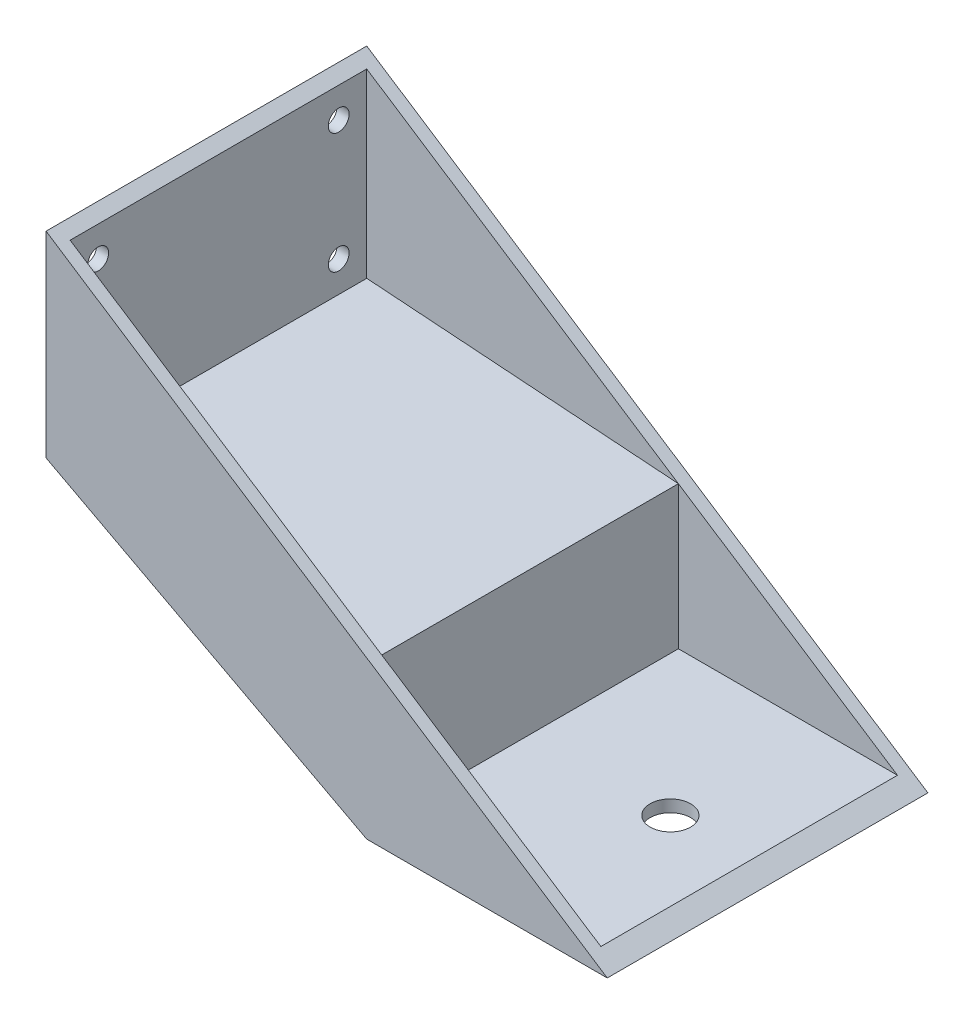
ISO-10303-21;
HEADER;
FILE_DESCRIPTION(('STEP AP214'),'2;1');
FILE_NAME('part.step','',(''),(''),'','','');
FILE_SCHEMA(('AUTOMOTIVE_DESIGN { 1 0 10303 214 1 1 1 1 }'));
ENDSEC;
DATA;
#1=APPLICATION_CONTEXT('core data for automotive mechanical design processes');
#2=APPLICATION_PROTOCOL_DEFINITION('international standard','automotive_design',2000,#1);
#3=PRODUCT_CONTEXT('',#1,'mechanical');
#4=PRODUCT('Part','Part','',(#3));
#5=PRODUCT_RELATED_PRODUCT_CATEGORY('part','',(#4));
#6=PRODUCT_DEFINITION_FORMATION('','',#4);
#7=PRODUCT_DEFINITION_CONTEXT('part definition',#1,'design');
#8=PRODUCT_DEFINITION('design','',#6,#7);
#9=PRODUCT_DEFINITION_SHAPE('','',#8);
#10=(LENGTH_UNIT() NAMED_UNIT(*) SI_UNIT(.MILLI.,.METRE.));
#11=(NAMED_UNIT(*) PLANE_ANGLE_UNIT() SI_UNIT($,.RADIAN.));
#12=(NAMED_UNIT(*) SI_UNIT($,.STERADIAN.) SOLID_ANGLE_UNIT());
#13=UNCERTAINTY_MEASURE_WITH_UNIT(LENGTH_MEASURE(1.E-05),#10,'distance_accuracy_value','');
#14=(GEOMETRIC_REPRESENTATION_CONTEXT(3) GLOBAL_UNCERTAINTY_ASSIGNED_CONTEXT((#13)) GLOBAL_UNIT_ASSIGNED_CONTEXT((#10,
#11,#12)) REPRESENTATION_CONTEXT('',''));
#15=CARTESIAN_POINT('',(0.,0.,0.));
#16=DIRECTION('',(0.,0.,1.));
#17=DIRECTION('',(1.,0.,0.));
#18=AXIS2_PLACEMENT_3D('',#15,#16,#17);
#19=CARTESIAN_POINT('',(0.,0.,77.));
#20=DIRECTION('',(0.,0.,1.));
#21=DIRECTION('',(1.,0.,0.));
#22=AXIS2_PLACEMENT_3D('',#19,#20,#21);
#23=PLANE('',#22);
#24=DIRECTION('',(-0.997508842822272,0.0705415373476658,0.));
#25=VECTOR('',#24,1.);
#26=CARTESIAN_POINT('',(3.,1.80610952489021,77.));
#27=LINE('',#26,#25);
#28=CARTESIAN_POINT('',(80.7452330011999,-3.69185502632156,77.));
#29=VERTEX_POINT('',#28);
#30=CARTESIAN_POINT('',(3.,1.80610952489021,77.));
#31=VERTEX_POINT('',#30);
#32=EDGE_CURVE('E125',#29,#31,#27,.T.);
#33=ORIENTED_EDGE('',*,*,#32,.T.);
#34=DIRECTION('',(0.,-1.,0.));
#35=VECTOR('',#34,1.);
#36=CARTESIAN_POINT('',(3.,49.,77.));
#37=LINE('',#36,#35);
#38=CARTESIAN_POINT('',(3.,47.0422922914023,77.));
#39=VERTEX_POINT('',#38);
#40=EDGE_CURVE('E139',#39,#31,#37,.T.);
#41=ORIENTED_EDGE('',*,*,#40,.F.);
#42=DIRECTION('',(-0.837459081737209,0.546500033317356,0.));
#43=VECTOR('',#42,1.);
#44=CARTESIAN_POINT('',(140.,-42.3596930678916,77.));
#45=LINE('',#44,#43);
#46=EDGE_CURVE('E141',#29,#39,#45,.T.);
#47=ORIENTED_EDGE('',*,*,#46,.F.);
#48=EDGE_LOOP('',(#33,#41,#47));
#49=FACE_BOUND('',#48,.T.);
#50=ADVANCED_FACE('F41',(#49),#23,.F.);
#51=DIRECTION('',(0.,1.,0.));
#52=VECTOR('',#51,1.);
#53=CARTESIAN_POINT('',(80.7452330011999,-39.3596930678916,77.));
#54=LINE('',#53,#52);
#55=CARTESIAN_POINT('',(80.7452330011999,-39.3596930678916,77.));
#56=VERTEX_POINT('',#55);
#57=EDGE_CURVE('E142',#56,#29,#54,.T.);
#58=ORIENTED_EDGE('',*,*,#57,.T.);
#59=CARTESIAN_POINT('',(135.402786656826,-39.3596930678916,77.));
#60=VERTEX_POINT('',#59);
#61=EDGE_CURVE('E56',#60,#29,#45,.T.);
#62=ORIENTED_EDGE('',*,*,#61,.F.);
#63=DIRECTION('',(1.,0.,0.));
#64=VECTOR('',#63,1.);
#65=CARTESIAN_POINT('',(80.,-39.3596930678916,77.));
#66=LINE('',#65,#64);
#67=EDGE_CURVE('E147',#56,#60,#66,.T.);
#68=ORIENTED_EDGE('',*,*,#67,.F.);
#69=EDGE_LOOP('',(#58,#62,#68));
#70=FACE_BOUND('',#69,.T.);
#71=ADVANCED_FACE('F212',(#70),#23,.F.);
#72=CARTESIAN_POINT('',(0.,0.,3.));
#73=DIRECTION('',(0.,0.,1.));
#74=DIRECTION('',(1.,0.,0.));
#75=AXIS2_PLACEMENT_3D('',#72,#73,#74);
#76=PLANE('',#75);
#77=DIRECTION('',(0.,-1.,0.));
#78=VECTOR('',#77,1.);
#79=CARTESIAN_POINT('',(3.,49.,3.));
#80=LINE('',#79,#78);
#81=CARTESIAN_POINT('',(3.,47.0422922914023,3.));
#82=VERTEX_POINT('',#81);
#83=CARTESIAN_POINT('',(3.,1.80610952489021,3.));
#84=VERTEX_POINT('',#83);
#85=EDGE_CURVE('E156',#82,#84,#80,.T.);
#86=ORIENTED_EDGE('',*,*,#85,.T.);
#87=DIRECTION('',(-0.997508842822272,0.0705415373476657,0.));
#88=VECTOR('',#87,1.);
#89=CARTESIAN_POINT('',(3.,1.80610952489021,3.));
#90=LINE('',#89,#88);
#91=CARTESIAN_POINT('',(80.7452330011999,-3.69185502632156,3.));
#92=VERTEX_POINT('',#91);
#93=EDGE_CURVE('E128',#92,#84,#90,.T.);
#94=ORIENTED_EDGE('',*,*,#93,.F.);
#95=DIRECTION('',(-0.837459081737209,0.546500033317356,0.));
#96=VECTOR('',#95,1.);
#97=CARTESIAN_POINT('',(140.,-42.3596930678916,3.));
#98=LINE('',#97,#96);
#99=EDGE_CURVE('E165',#92,#82,#98,.T.);
#100=ORIENTED_EDGE('',*,*,#99,.T.);
#101=EDGE_LOOP('',(#86,#94,#100));
#102=FACE_BOUND('',#101,.T.);
#103=ADVANCED_FACE('F218',(#102),#76,.T.);
#104=CARTESIAN_POINT('',(135.402786656826,-39.3596930678916,3.));
#105=VERTEX_POINT('',#104);
#106=EDGE_CURVE('E162',#105,#92,#98,.T.);
#107=ORIENTED_EDGE('',*,*,#106,.T.);
#108=DIRECTION('',(0.,1.,0.));
#109=VECTOR('',#108,1.);
#110=CARTESIAN_POINT('',(80.7452330011999,-39.3596930678916,3.));
#111=LINE('',#110,#109);
#112=CARTESIAN_POINT('',(80.7452330011999,-39.3596930678916,3.));
#113=VERTEX_POINT('',#112);
#114=EDGE_CURVE('E273',#113,#92,#111,.T.);
#115=ORIENTED_EDGE('',*,*,#114,.F.);
#116=DIRECTION('',(1.,0.,0.));
#117=VECTOR('',#116,1.);
#118=CARTESIAN_POINT('',(80.,-39.3596930678916,3.));
#119=LINE('',#118,#117);
#120=EDGE_CURVE('E155',#113,#105,#119,.T.);
#121=ORIENTED_EDGE('',*,*,#120,.T.);
#122=EDGE_LOOP('',(#107,#115,#121));
#123=FACE_BOUND('',#122,.T.);
#124=ADVANCED_FACE('F224',(#123),#76,.T.);
#125=CARTESIAN_POINT('',(140.,-42.3596930678916,80.));
#126=DIRECTION('',(-0.546500033317356,-0.837459081737209,0.));
#127=DIRECTION('',(0.837459081737209,-0.546500033317356,0.));
#128=AXIS2_PLACEMENT_3D('',#125,#126,#127);
#129=PLANE('',#128);
#130=DIRECTION('',(-0.837459081737209,0.546500033317356,0.));
#131=VECTOR('',#130,1.);
#132=CARTESIAN_POINT('',(140.,-42.3596930678916,0.));
#133=LINE('',#132,#131);
#134=CARTESIAN_POINT('',(140.,-42.3596930678916,0.));
#135=VERTEX_POINT('',#134);
#136=CARTESIAN_POINT('',(0.,49.,0.));
#137=VERTEX_POINT('',#136);
#138=EDGE_CURVE('E158',#135,#137,#133,.T.);
#139=ORIENTED_EDGE('',*,*,#138,.T.);
#140=DIRECTION('',(0.,0.,-1.));
#141=VECTOR('',#140,1.);
#142=CARTESIAN_POINT('',(0.,49.,80.));
#143=LINE('',#142,#141);
#144=CARTESIAN_POINT('',(0.,49.,80.));
#145=VERTEX_POINT('',#144);
#146=EDGE_CURVE('E11',#145,#137,#143,.T.);
#147=ORIENTED_EDGE('',*,*,#146,.F.);
#148=DIRECTION('',(-0.837459081737209,0.546500033317356,0.));
#149=VECTOR('',#148,1.);
#150=CARTESIAN_POINT('',(140.,-42.3596930678916,80.));
#151=LINE('',#150,#149);
#152=CARTESIAN_POINT('',(140.,-42.3596930678916,80.));
#153=VERTEX_POINT('',#152);
#154=EDGE_CURVE('E166',#153,#145,#151,.T.);
#155=ORIENTED_EDGE('',*,*,#154,.F.);
#156=DIRECTION('',(0.,0.,-1.));
#157=VECTOR('',#156,1.);
#158=CARTESIAN_POINT('',(140.,-42.3596930678916,80.));
#159=LINE('',#158,#157);
#160=EDGE_CURVE('E172',#153,#135,#159,.T.);
#161=ORIENTED_EDGE('',*,*,#160,.T.);
#162=EDGE_LOOP('',(#139,#147,#155,#161));
#163=FACE_BOUND('',#162,.T.);
#164=ORIENTED_EDGE('',*,*,#106,.F.);
#165=DIRECTION('',(0.,0.,-1.));
#166=VECTOR('',#165,1.);
#167=CARTESIAN_POINT('',(135.402786656826,-39.3596930678916,80.));
#168=LINE('',#167,#166);
#169=EDGE_CURVE('E149',#60,#105,#168,.T.);
#170=ORIENTED_EDGE('',*,*,#169,.F.);
#171=ORIENTED_EDGE('',*,*,#61,.T.);
#172=ORIENTED_EDGE('',*,*,#46,.T.);
#173=DIRECTION('',(0.,0.,-1.));
#174=VECTOR('',#173,1.);
#175=CARTESIAN_POINT('',(3.,47.0422922914023,80.));
#176=LINE('',#175,#174);
#177=EDGE_CURVE('E133',#39,#82,#176,.T.);
#178=ORIENTED_EDGE('',*,*,#177,.T.);
#179=ORIENTED_EDGE('',*,*,#99,.F.);
#180=EDGE_LOOP('',(#164,#170,#171,#172,#178,#179));
#181=FACE_BOUND('',#180,.T.);
#182=ADVANCED_FACE('F43',(#163,#181),#129,.F.);
#183=CARTESIAN_POINT('',(0.,49.,80.));
#184=DIRECTION('',(1.,0.,0.));
#185=DIRECTION('',(0.,1.,0.));
#186=AXIS2_PLACEMENT_3D('',#183,#184,#185);
#187=PLANE('',#186);
#188=CARTESIAN_POINT('',(0.,9.5,70.));
#189=DIRECTION('',(-1.,0.,0.));
#190=DIRECTION('',(0.,-1.,0.));
#191=AXIS2_PLACEMENT_3D('',#188,#189,#190);
#192=CIRCLE('',#191,2.6);
#193=CARTESIAN_POINT('',(0.,6.9,70.));
#194=VERTEX_POINT('',#193);
#195=EDGE_CURVE('E277',#194,#194,#192,.T.);
#196=ORIENTED_EDGE('',*,*,#195,.F.);
#197=EDGE_LOOP('',(#196));
#198=FACE_BOUND('',#197,.T.);
#199=CARTESIAN_POINT('',(0.,39.5,70.));
#200=DIRECTION('',(-1.,0.,0.));
#201=DIRECTION('',(0.,-1.,0.));
#202=AXIS2_PLACEMENT_3D('',#199,#200,#201);
#203=CIRCLE('',#202,2.6);
#204=CARTESIAN_POINT('',(0.,36.9,70.));
#205=VERTEX_POINT('',#204);
#206=EDGE_CURVE('E290',#205,#205,#203,.T.);
#207=ORIENTED_EDGE('',*,*,#206,.F.);
#208=EDGE_LOOP('',(#207));
#209=FACE_BOUND('',#208,.T.);
#210=CARTESIAN_POINT('',(0.,39.5,10.));
#211=DIRECTION('',(-1.,0.,0.));
#212=DIRECTION('',(0.,-1.,0.));
#213=AXIS2_PLACEMENT_3D('',#210,#211,#212);
#214=CIRCLE('',#213,2.6);
#215=CARTESIAN_POINT('',(0.,36.9,10.));
#216=VERTEX_POINT('',#215);
#217=EDGE_CURVE('E284',#216,#216,#214,.T.);
#218=ORIENTED_EDGE('',*,*,#217,.F.);
#219=EDGE_LOOP('',(#218));
#220=FACE_BOUND('',#219,.T.);
#221=CARTESIAN_POINT('',(0.,9.5,10.));
#222=DIRECTION('',(-1.,0.,0.));
#223=DIRECTION('',(0.,-1.,0.));
#224=AXIS2_PLACEMENT_3D('',#221,#222,#223);
#225=CIRCLE('',#224,2.6);
#226=CARTESIAN_POINT('',(0.,6.9,10.));
#227=VERTEX_POINT('',#226);
#228=EDGE_CURVE('E297',#227,#227,#225,.T.);
#229=ORIENTED_EDGE('',*,*,#228,.F.);
#230=EDGE_LOOP('',(#229));
#231=FACE_BOUND('',#230,.T.);
#232=DIRECTION('',(0.,-1.,0.));
#233=VECTOR('',#232,1.);
#234=CARTESIAN_POINT('',(0.,49.,0.));
#235=LINE('',#234,#233);
#236=CARTESIAN_POINT('',(0.,0.,0.));
#237=VERTEX_POINT('',#236);
#238=EDGE_CURVE('E175',#137,#237,#235,.T.);
#239=ORIENTED_EDGE('',*,*,#238,.T.);
#240=DIRECTION('',(0.,0.,-1.));
#241=VECTOR('',#240,1.);
#242=CARTESIAN_POINT('',(0.,0.,80.));
#243=LINE('',#242,#241);
#244=CARTESIAN_POINT('',(0.,0.,80.));
#245=VERTEX_POINT('',#244);
#246=EDGE_CURVE('E49',#245,#237,#243,.T.);
#247=ORIENTED_EDGE('',*,*,#246,.F.);
#248=DIRECTION('',(0.,-1.,0.));
#249=VECTOR('',#248,1.);
#250=CARTESIAN_POINT('',(0.,49.,80.));
#251=LINE('',#250,#249);
#252=EDGE_CURVE('E93',#145,#245,#251,.T.);
#253=ORIENTED_EDGE('',*,*,#252,.F.);
#254=ORIENTED_EDGE('',*,*,#146,.T.);
#255=EDGE_LOOP('',(#239,#247,#253,#254));
#256=FACE_BOUND('',#255,.T.);
#257=ADVANCED_FACE('F207',(#198,#209,#220,#231,#256),#187,.F.);
#258=CARTESIAN_POINT('',(0.,0.,80.));
#259=DIRECTION('',(0.467945978597945,0.883757071323343,0.));
#260=DIRECTION('',(-0.883757071323343,0.467945978597945,0.));
#261=AXIS2_PLACEMENT_3D('',#258,#259,#260);
#262=PLANE('',#261);
#263=DIRECTION('',(0.883757071323342,-0.467945978597945,0.));
#264=VECTOR('',#263,1.);
#265=CARTESIAN_POINT('',(0.,0.,0.));
#266=LINE('',#265,#264);
#267=CARTESIAN_POINT('',(80.,-42.3596930678916,0.));
#268=VERTEX_POINT('',#267);
#269=EDGE_CURVE('E177',#237,#268,#266,.T.);
#270=ORIENTED_EDGE('',*,*,#269,.T.);
#271=DIRECTION('',(0.,0.,-1.));
#272=VECTOR('',#271,1.);
#273=CARTESIAN_POINT('',(80.,-42.3596930678916,80.));
#274=LINE('',#273,#272);
#275=CARTESIAN_POINT('',(80.,-42.3596930678916,80.));
#276=VERTEX_POINT('',#275);
#277=EDGE_CURVE('E181',#276,#268,#274,.T.);
#278=ORIENTED_EDGE('',*,*,#277,.F.);
#279=DIRECTION('',(0.883757071323342,-0.467945978597945,0.));
#280=VECTOR('',#279,1.);
#281=CARTESIAN_POINT('',(0.,0.,80.));
#282=LINE('',#281,#280);
#283=EDGE_CURVE('E169',#245,#276,#282,.T.);
#284=ORIENTED_EDGE('',*,*,#283,.F.);
#285=ORIENTED_EDGE('',*,*,#246,.T.);
#286=EDGE_LOOP('',(#270,#278,#284,#285));
#287=FACE_BOUND('',#286,.T.);
#288=ADVANCED_FACE('F186',(#287),#262,.F.);
#289=CARTESIAN_POINT('',(80.,-42.3596930678916,80.));
#290=DIRECTION('',(0.,1.,0.));
#291=DIRECTION('',(0.,0.,1.));
#292=AXIS2_PLACEMENT_3D('',#289,#290,#291);
#293=PLANE('',#292);
#294=CARTESIAN_POINT('',(115.7452330012,-42.3596930678916,40.));
#295=DIRECTION('',(0.,1.,0.));
#296=DIRECTION('',(0.,0.,1.));
#297=AXIS2_PLACEMENT_3D('',#294,#295,#296);
#298=CIRCLE('',#297,5.05);
#299=CARTESIAN_POINT('',(115.7452330012,-42.3596930678916,45.05));
#300=VERTEX_POINT('',#299);
#301=EDGE_CURVE('E143',#300,#300,#298,.F.);
#302=ORIENTED_EDGE('',*,*,#301,.F.);
#303=EDGE_LOOP('',(#302));
#304=FACE_BOUND('',#303,.T.);
#305=DIRECTION('',(1.,0.,0.));
#306=VECTOR('',#305,1.);
#307=CARTESIAN_POINT('',(80.,-42.3596930678916,0.));
#308=LINE('',#307,#306);
#309=EDGE_CURVE('E86',#268,#135,#308,.T.);
#310=ORIENTED_EDGE('',*,*,#309,.T.);
#311=ORIENTED_EDGE('',*,*,#160,.F.);
#312=DIRECTION('',(1.,0.,0.));
#313=VECTOR('',#312,1.);
#314=CARTESIAN_POINT('',(80.,-42.3596930678916,80.));
#315=LINE('',#314,#313);
#316=EDGE_CURVE('E65',#276,#153,#315,.T.);
#317=ORIENTED_EDGE('',*,*,#316,.F.);
#318=ORIENTED_EDGE('',*,*,#277,.T.);
#319=EDGE_LOOP('',(#310,#311,#317,#318));
#320=FACE_BOUND('',#319,.T.);
#321=ADVANCED_FACE('F195',(#304,#320),#293,.F.);
#322=CARTESIAN_POINT('',(0.,0.,80.));
#323=DIRECTION('',(0.,0.,1.));
#324=DIRECTION('',(1.,0.,0.));
#325=AXIS2_PLACEMENT_3D('',#322,#323,#324);
#326=PLANE('',#325);
#327=ORIENTED_EDGE('',*,*,#154,.T.);
#328=ORIENTED_EDGE('',*,*,#252,.T.);
#329=ORIENTED_EDGE('',*,*,#283,.T.);
#330=ORIENTED_EDGE('',*,*,#316,.T.);
#331=EDGE_LOOP('',(#327,#328,#329,#330));
#332=FACE_BOUND('',#331,.T.);
#333=ADVANCED_FACE('F197',(#332),#326,.T.);
#334=CARTESIAN_POINT('',(0.,0.,0.));
#335=DIRECTION('',(0.,0.,1.));
#336=DIRECTION('',(1.,0.,0.));
#337=AXIS2_PLACEMENT_3D('',#334,#335,#336);
#338=PLANE('',#337);
#339=ORIENTED_EDGE('',*,*,#138,.F.);
#340=ORIENTED_EDGE('',*,*,#309,.F.);
#341=ORIENTED_EDGE('',*,*,#269,.F.);
#342=ORIENTED_EDGE('',*,*,#238,.F.);
#343=EDGE_LOOP('',(#339,#340,#341,#342));
#344=FACE_BOUND('',#343,.T.);
#345=ADVANCED_FACE('F190',(#344),#338,.F.);
#346=CARTESIAN_POINT('',(3.,49.,80.));
#347=DIRECTION('',(1.,0.,0.));
#348=DIRECTION('',(0.,1.,0.));
#349=AXIS2_PLACEMENT_3D('',#346,#347,#348);
#350=PLANE('',#349);
#351=CARTESIAN_POINT('',(3.,9.5,70.));
#352=DIRECTION('',(1.,0.,0.));
#353=DIRECTION('',(0.,1.,0.));
#354=AXIS2_PLACEMENT_3D('',#351,#352,#353);
#355=CIRCLE('',#354,2.6);
#356=CARTESIAN_POINT('',(3.,12.1,70.));
#357=VERTEX_POINT('',#356);
#358=EDGE_CURVE('E293',#357,#357,#355,.F.);
#359=ORIENTED_EDGE('',*,*,#358,.T.);
#360=EDGE_LOOP('',(#359));
#361=FACE_BOUND('',#360,.T.);
#362=CARTESIAN_POINT('',(3.,39.5,70.));
#363=DIRECTION('',(1.,0.,0.));
#364=DIRECTION('',(0.,1.,0.));
#365=AXIS2_PLACEMENT_3D('',#362,#363,#364);
#366=CIRCLE('',#365,2.6);
#367=CARTESIAN_POINT('',(3.,42.1,70.));
#368=VERTEX_POINT('',#367);
#369=EDGE_CURVE('E287',#368,#368,#366,.F.);
#370=ORIENTED_EDGE('',*,*,#369,.T.);
#371=EDGE_LOOP('',(#370));
#372=FACE_BOUND('',#371,.T.);
#373=CARTESIAN_POINT('',(3.,39.5,10.));
#374=DIRECTION('',(1.,0.,0.));
#375=DIRECTION('',(0.,1.,0.));
#376=AXIS2_PLACEMENT_3D('',#373,#374,#375);
#377=CIRCLE('',#376,2.6);
#378=CARTESIAN_POINT('',(3.,42.1,10.));
#379=VERTEX_POINT('',#378);
#380=EDGE_CURVE('E280',#379,#379,#377,.F.);
#381=ORIENTED_EDGE('',*,*,#380,.T.);
#382=EDGE_LOOP('',(#381));
#383=FACE_BOUND('',#382,.T.);
#384=CARTESIAN_POINT('',(3.,9.5,10.));
#385=DIRECTION('',(1.,0.,0.));
#386=DIRECTION('',(0.,1.,0.));
#387=AXIS2_PLACEMENT_3D('',#384,#385,#386);
#388=CIRCLE('',#387,2.6);
#389=CARTESIAN_POINT('',(3.,12.1,10.));
#390=VERTEX_POINT('',#389);
#391=EDGE_CURVE('E283',#390,#390,#388,.F.);
#392=ORIENTED_EDGE('',*,*,#391,.T.);
#393=EDGE_LOOP('',(#392));
#394=FACE_BOUND('',#393,.T.);
#395=ORIENTED_EDGE('',*,*,#85,.F.);
#396=ORIENTED_EDGE('',*,*,#177,.F.);
#397=ORIENTED_EDGE('',*,*,#40,.T.);
#398=DIRECTION('',(0.,0.,-1.));
#399=VECTOR('',#398,1.);
#400=CARTESIAN_POINT('',(3.,1.80610952489021,80.));
#401=LINE('',#400,#399);
#402=EDGE_CURVE('E122',#31,#84,#401,.T.);
#403=ORIENTED_EDGE('',*,*,#402,.T.);
#404=EDGE_LOOP('',(#395,#396,#397,#403));
#405=FACE_BOUND('',#404,.T.);
#406=ADVANCED_FACE('F145',(#361,#372,#383,#394,#405),#350,.T.);
#407=CARTESIAN_POINT('',(80.,-39.3596930678916,80.));
#408=DIRECTION('',(0.,1.,0.));
#409=DIRECTION('',(0.,0.,1.));
#410=AXIS2_PLACEMENT_3D('',#407,#408,#409);
#411=PLANE('',#410);
#412=CARTESIAN_POINT('',(115.7452330012,-39.3596930678916,40.));
#413=DIRECTION('',(0.,1.,0.));
#414=DIRECTION('',(0.,0.,1.));
#415=AXIS2_PLACEMENT_3D('',#412,#413,#414);
#416=CIRCLE('',#415,5.05);
#417=CARTESIAN_POINT('',(115.7452330012,-39.3596930678916,45.05));
#418=VERTEX_POINT('',#417);
#419=EDGE_CURVE('E267',#418,#418,#416,.T.);
#420=ORIENTED_EDGE('',*,*,#419,.F.);
#421=EDGE_LOOP('',(#420));
#422=FACE_BOUND('',#421,.T.);
#423=ORIENTED_EDGE('',*,*,#120,.F.);
#424=DIRECTION('',(0.,0.,-1.));
#425=VECTOR('',#424,1.);
#426=CARTESIAN_POINT('',(80.7452330011999,-39.3596930678916,80.));
#427=LINE('',#426,#425);
#428=EDGE_CURVE('E134',#56,#113,#427,.T.);
#429=ORIENTED_EDGE('',*,*,#428,.F.);
#430=ORIENTED_EDGE('',*,*,#67,.T.);
#431=ORIENTED_EDGE('',*,*,#169,.T.);
#432=EDGE_LOOP('',(#423,#429,#430,#431));
#433=FACE_BOUND('',#432,.T.);
#434=ADVANCED_FACE('F221',(#422,#433),#411,.T.);
#435=CARTESIAN_POINT('',(140.001,9.50000000000001,10.));
#436=DIRECTION('',(-1.,0.,0.));
#437=DIRECTION('',(0.,-1.,0.));
#438=AXIS2_PLACEMENT_3D('',#435,#436,#437);
#439=CYLINDRICAL_SURFACE('',#438,2.6);
#440=ORIENTED_EDGE('',*,*,#391,.F.);
#441=EDGE_LOOP('',(#440));
#442=FACE_BOUND('',#441,.T.);
#443=ORIENTED_EDGE('',*,*,#228,.T.);
#444=EDGE_LOOP('',(#443));
#445=FACE_BOUND('',#444,.T.);
#446=ADVANCED_FACE('F236',(#442,#445),#439,.F.);
#447=CARTESIAN_POINT('',(140.001,39.5,10.));
#448=DIRECTION('',(-1.,0.,0.));
#449=DIRECTION('',(0.,-1.,0.));
#450=AXIS2_PLACEMENT_3D('',#447,#448,#449);
#451=CYLINDRICAL_SURFACE('',#450,2.6);
#452=ORIENTED_EDGE('',*,*,#380,.F.);
#453=EDGE_LOOP('',(#452));
#454=FACE_BOUND('',#453,.T.);
#455=ORIENTED_EDGE('',*,*,#217,.T.);
#456=EDGE_LOOP('',(#455));
#457=FACE_BOUND('',#456,.T.);
#458=ADVANCED_FACE('F243',(#454,#457),#451,.F.);
#459=CARTESIAN_POINT('',(140.001,39.5,70.));
#460=DIRECTION('',(-1.,0.,0.));
#461=DIRECTION('',(0.,-1.,0.));
#462=AXIS2_PLACEMENT_3D('',#459,#460,#461);
#463=CYLINDRICAL_SURFACE('',#462,2.6);
#464=ORIENTED_EDGE('',*,*,#369,.F.);
#465=EDGE_LOOP('',(#464));
#466=FACE_BOUND('',#465,.T.);
#467=ORIENTED_EDGE('',*,*,#206,.T.);
#468=EDGE_LOOP('',(#467));
#469=FACE_BOUND('',#468,.T.);
#470=ADVANCED_FACE('F247',(#466,#469),#463,.F.);
#471=CARTESIAN_POINT('',(140.001,9.50000000000001,70.));
#472=DIRECTION('',(-1.,0.,0.));
#473=DIRECTION('',(0.,-1.,0.));
#474=AXIS2_PLACEMENT_3D('',#471,#472,#473);
#475=CYLINDRICAL_SURFACE('',#474,2.6);
#476=ORIENTED_EDGE('',*,*,#358,.F.);
#477=EDGE_LOOP('',(#476));
#478=FACE_BOUND('',#477,.T.);
#479=ORIENTED_EDGE('',*,*,#195,.T.);
#480=EDGE_LOOP('',(#479));
#481=FACE_BOUND('',#480,.T.);
#482=ADVANCED_FACE('F245',(#478,#481),#475,.F.);
#483=CARTESIAN_POINT('',(3.,1.80610952489021,80.002));
#484=DIRECTION('',(-0.0705415373476657,-0.997508842822272,0.));
#485=DIRECTION('',(0.997508842822272,-0.0705415373476658,0.));
#486=AXIS2_PLACEMENT_3D('',#483,#484,#485);
#487=PLANE('',#486);
#488=ORIENTED_EDGE('',*,*,#32,.F.);
#489=DIRECTION('',(0.,0.,-1.));
#490=VECTOR('',#489,1.);
#491=CARTESIAN_POINT('',(80.7452330011999,-3.69185502632156,80.002));
#492=LINE('',#491,#490);
#493=EDGE_CURVE('E274',#29,#92,#492,.T.);
#494=ORIENTED_EDGE('',*,*,#493,.T.);
#495=ORIENTED_EDGE('',*,*,#93,.T.);
#496=ORIENTED_EDGE('',*,*,#402,.F.);
#497=EDGE_LOOP('',(#488,#494,#495,#496));
#498=FACE_BOUND('',#497,.T.);
#499=ADVANCED_FACE('F124',(#498),#487,.F.);
#500=CARTESIAN_POINT('',(80.7452330011999,-39.3596930678916,80.002));
#501=DIRECTION('',(-1.,0.,0.));
#502=DIRECTION('',(0.,-1.,0.));
#503=AXIS2_PLACEMENT_3D('',#500,#501,#502);
#504=PLANE('',#503);
#505=ORIENTED_EDGE('',*,*,#57,.F.);
#506=ORIENTED_EDGE('',*,*,#428,.T.);
#507=ORIENTED_EDGE('',*,*,#114,.T.);
#508=ORIENTED_EDGE('',*,*,#493,.F.);
#509=EDGE_LOOP('',(#505,#506,#507,#508));
#510=FACE_BOUND('',#509,.T.);
#511=ADVANCED_FACE('F249',(#510),#504,.F.);
#512=CARTESIAN_POINT('',(115.7452330012,-42.3606930678916,40.));
#513=DIRECTION('',(0.,1.,0.));
#514=DIRECTION('',(0.,0.,1.));
#515=AXIS2_PLACEMENT_3D('',#512,#513,#514);
#516=CYLINDRICAL_SURFACE('',#515,5.05);
#517=ORIENTED_EDGE('',*,*,#419,.T.);
#518=EDGE_LOOP('',(#517));
#519=FACE_BOUND('',#518,.T.);
#520=ORIENTED_EDGE('',*,*,#301,.T.);
#521=EDGE_LOOP('',(#520));
#522=FACE_BOUND('',#521,.T.);
#523=ADVANCED_FACE('F257',(#519,#522),#516,.F.);
#524=CLOSED_SHELL('',(#50,#71,#103,#124,#182,#257,#288,#321,#333,#345,#406,#434,#446,#458,#470,
#482,#499,#511,#523));
#525=MANIFOLD_SOLID_BREP('B2',#524);
#526=ADVANCED_BREP_SHAPE_REPRESENTATION('',(#18,#525),#14);
#527=SHAPE_DEFINITION_REPRESENTATION(#9,#526);
ENDSEC;
END-ISO-10303-21;
